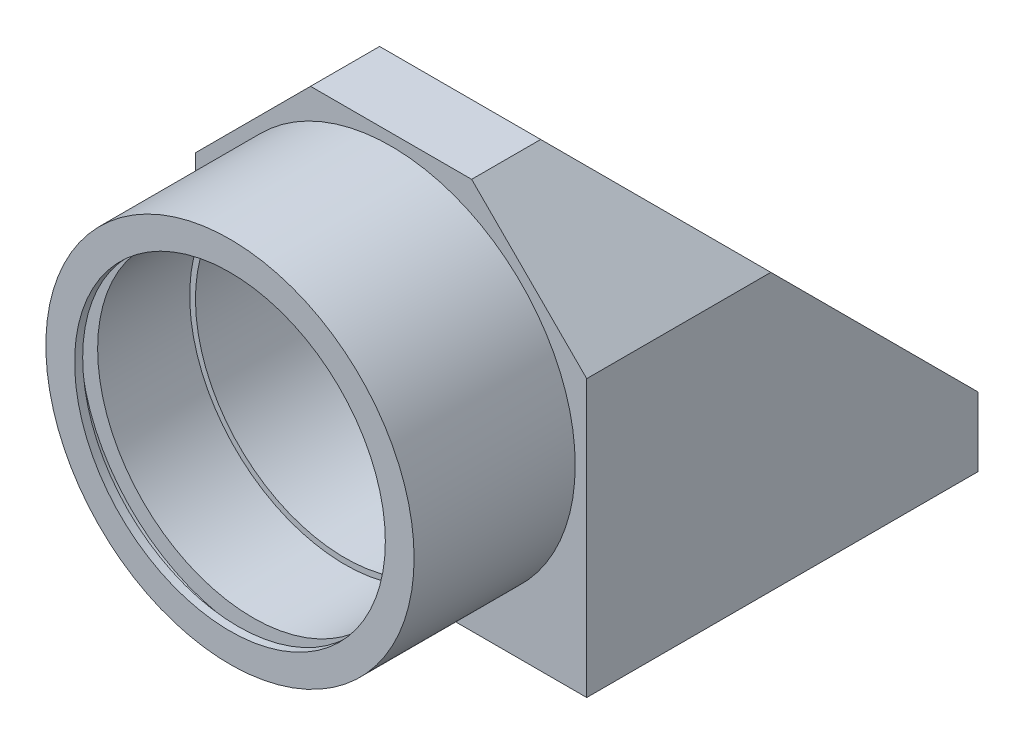
ISO-10303-21;
HEADER;
FILE_DESCRIPTION(('STEP AP214'),'2;1');
FILE_NAME('part.step','',(''),(''),'','','');
FILE_SCHEMA(('AUTOMOTIVE_DESIGN { 1 0 10303 214 1 1 1 1 }'));
ENDSEC;
DATA;
#1=APPLICATION_CONTEXT('core data for automotive mechanical design processes');
#2=APPLICATION_PROTOCOL_DEFINITION('international standard','automotive_design',2000,#1);
#3=PRODUCT_CONTEXT('',#1,'mechanical');
#4=PRODUCT('Part','Part','',(#3));
#5=PRODUCT_RELATED_PRODUCT_CATEGORY('part','',(#4));
#6=PRODUCT_DEFINITION_FORMATION('','',#4);
#7=PRODUCT_DEFINITION_CONTEXT('part definition',#1,'design');
#8=PRODUCT_DEFINITION('design','',#6,#7);
#9=PRODUCT_DEFINITION_SHAPE('','',#8);
#10=(LENGTH_UNIT() NAMED_UNIT(*) SI_UNIT(.MILLI.,.METRE.));
#11=(NAMED_UNIT(*) PLANE_ANGLE_UNIT() SI_UNIT($,.RADIAN.));
#12=(NAMED_UNIT(*) SI_UNIT($,.STERADIAN.) SOLID_ANGLE_UNIT());
#13=UNCERTAINTY_MEASURE_WITH_UNIT(LENGTH_MEASURE(1.E-05),#10,'distance_accuracy_value','');
#14=(GEOMETRIC_REPRESENTATION_CONTEXT(3) GLOBAL_UNCERTAINTY_ASSIGNED_CONTEXT((#13)) GLOBAL_UNIT_ASSIGNED_CONTEXT((#10,
#11,#12)) REPRESENTATION_CONTEXT('',''));
#15=CARTESIAN_POINT('',(0.,0.,0.));
#16=DIRECTION('',(0.,0.,1.));
#17=DIRECTION('',(1.,0.,0.));
#18=AXIS2_PLACEMENT_3D('',#15,#16,#17);
#19=CARTESIAN_POINT('',(0.,0.,38.));
#20=DIRECTION('',(0.,0.,1.));
#21=DIRECTION('',(1.,0.,0.));
#22=AXIS2_PLACEMENT_3D('',#19,#20,#21);
#23=CYLINDRICAL_SURFACE('',#22,13.5);
#24=CARTESIAN_POINT('',(0.,0.,46.));
#25=DIRECTION('',(0.,0.,-1.));
#26=DIRECTION('',(-1.,0.,0.));
#27=AXIS2_PLACEMENT_3D('',#24,#25,#26);
#28=CIRCLE('',#27,13.5);
#29=CARTESIAN_POINT('',(-13.5,0.,46.));
#30=VERTEX_POINT('',#29);
#31=EDGE_CURVE('E599',#30,#30,#28,.T.);
#32=ORIENTED_EDGE('',*,*,#31,.F.);
#33=EDGE_LOOP('',(#32));
#34=FACE_BOUND('',#33,.T.);
#35=CARTESIAN_POINT('',(0.,0.,38.));
#36=DIRECTION('',(0.,0.,1.));
#37=DIRECTION('',(1.,0.,0.));
#38=AXIS2_PLACEMENT_3D('',#35,#36,#37);
#39=CIRCLE('',#38,13.5);
#40=CARTESIAN_POINT('',(13.5,0.,38.));
#41=VERTEX_POINT('',#40);
#42=EDGE_CURVE('E201',#41,#41,#39,.T.);
#43=ORIENTED_EDGE('',*,*,#42,.F.);
#44=EDGE_LOOP('',(#43));
#45=FACE_BOUND('',#44,.T.);
#46=ADVANCED_FACE('F37',(#34,#45),#23,.F.);
#47=CARTESIAN_POINT('',(17.,17.,48.));
#48=DIRECTION('',(0.,0.,-1.));
#49=DIRECTION('',(-1.,0.,0.));
#50=AXIS2_PLACEMENT_3D('',#47,#48,#49);
#51=PLANE('',#50);
#52=CARTESIAN_POINT('',(0.,0.,48.));
#53=DIRECTION('',(0.,0.,1.));
#54=DIRECTION('',(1.,0.,0.));
#55=AXIS2_PLACEMENT_3D('',#52,#53,#54);
#56=CIRCLE('',#55,13.5);
#57=CARTESIAN_POINT('',(13.5,0.,48.));
#58=VERTEX_POINT('',#57);
#59=EDGE_CURVE('E200',#58,#58,#56,.T.);
#60=ORIENTED_EDGE('',*,*,#59,.F.);
#61=EDGE_LOOP('',(#60));
#62=FACE_BOUND('',#61,.T.);
#63=CARTESIAN_POINT('',(0.,0.,48.));
#64=DIRECTION('',(0.,0.,1.));
#65=DIRECTION('',(1.,0.,0.));
#66=AXIS2_PLACEMENT_3D('',#63,#64,#65);
#67=CIRCLE('',#66,16.);
#68=CARTESIAN_POINT('',(16.,0.,48.));
#69=VERTEX_POINT('',#68);
#70=EDGE_CURVE('E168',#69,#69,#67,.T.);
#71=ORIENTED_EDGE('',*,*,#70,.T.);
#72=EDGE_LOOP('',(#71));
#73=FACE_BOUND('',#72,.T.);
#74=ADVANCED_FACE('F298',(#62,#73),#51,.F.);
#75=CARTESIAN_POINT('',(17.,-17.,48.));
#76=DIRECTION('',(-1.,0.,0.));
#77=DIRECTION('',(0.,0.,1.));
#78=AXIS2_PLACEMENT_3D('',#75,#76,#77);
#79=PLANE('',#78);
#80=DIRECTION('',(0.,1.,0.));
#81=VECTOR('',#80,1.);
#82=CARTESIAN_POINT('',(17.,-17.,34.));
#83=LINE('',#82,#81);
#84=CARTESIAN_POINT('',(17.,-17.,34.));
#85=VERTEX_POINT('',#84);
#86=CARTESIAN_POINT('',(17.,6.99999999999996,34.));
#87=VERTEX_POINT('',#86);
#88=EDGE_CURVE('E184',#85,#87,#83,.T.);
#89=ORIENTED_EDGE('',*,*,#88,.F.);
#90=DIRECTION('',(0.,0.,-1.));
#91=VECTOR('',#90,1.);
#92=CARTESIAN_POINT('',(17.,-17.,48.));
#93=LINE('',#92,#91);
#94=CARTESIAN_POINT('',(17.,-17.,0.));
#95=VERTEX_POINT('',#94);
#96=EDGE_CURVE('E219',#85,#95,#93,.T.);
#97=ORIENTED_EDGE('',*,*,#96,.T.);
#98=DIRECTION('',(0.,1.,0.));
#99=VECTOR('',#98,1.);
#100=CARTESIAN_POINT('',(17.,-17.,0.));
#101=LINE('',#100,#99);
#102=CARTESIAN_POINT('',(17.,-11.0000000000002,0.));
#103=VERTEX_POINT('',#102);
#104=EDGE_CURVE('E211',#95,#103,#101,.T.);
#105=ORIENTED_EDGE('',*,*,#104,.T.);
#106=DIRECTION('',(0.,0.707106781186544,0.707106781186551));
#107=VECTOR('',#106,1.);
#108=CARTESIAN_POINT('',(17.,17.,28.0000000000005));
#109=LINE('',#108,#107);
#110=CARTESIAN_POINT('',(17.,6.99999999999994,18.0000000000003));
#111=VERTEX_POINT('',#110);
#112=EDGE_CURVE('E45',#103,#111,#109,.T.);
#113=ORIENTED_EDGE('',*,*,#112,.T.);
#114=DIRECTION('',(0.,0.,1.));
#115=VECTOR('',#114,1.);
#116=CARTESIAN_POINT('',(17.,6.99999999999994,48.));
#117=LINE('',#116,#115);
#118=EDGE_CURVE('E238',#111,#87,#117,.T.);
#119=ORIENTED_EDGE('',*,*,#118,.T.);
#120=EDGE_LOOP('',(#89,#97,#105,#113,#119));
#121=FACE_BOUND('',#120,.T.);
#122=ADVANCED_FACE('F274',(#121),#79,.F.);
#123=CARTESIAN_POINT('',(-17.,17.,48.));
#124=DIRECTION('',(0.,-1.,0.));
#125=DIRECTION('',(0.,0.,-1.));
#126=AXIS2_PLACEMENT_3D('',#123,#124,#125);
#127=PLANE('',#126);
#128=DIRECTION('',(-1.,0.,0.));
#129=VECTOR('',#128,1.);
#130=CARTESIAN_POINT('',(7.,17.,34.));
#131=LINE('',#130,#129);
#132=CARTESIAN_POINT('',(7.,17.,34.));
#133=VERTEX_POINT('',#132);
#134=CARTESIAN_POINT('',(-6.99999999999998,17.,34.));
#135=VERTEX_POINT('',#134);
#136=EDGE_CURVE('E52',#133,#135,#131,.T.);
#137=ORIENTED_EDGE('',*,*,#136,.F.);
#138=DIRECTION('',(0.,0.,-1.));
#139=VECTOR('',#138,1.);
#140=CARTESIAN_POINT('',(6.99999999999998,17.,48.));
#141=LINE('',#140,#139);
#142=CARTESIAN_POINT('',(6.99999999999998,17.,28.0000000000005));
#143=VERTEX_POINT('',#142);
#144=EDGE_CURVE('E236',#133,#143,#141,.T.);
#145=ORIENTED_EDGE('',*,*,#144,.T.);
#146=DIRECTION('',(-1.,0.,0.));
#147=VECTOR('',#146,1.);
#148=CARTESIAN_POINT('',(-6.99999999999998,17.,28.0000000000005));
#149=LINE('',#148,#147);
#150=CARTESIAN_POINT('',(-6.99999999999998,17.,28.0000000000005));
#151=VERTEX_POINT('',#150);
#152=EDGE_CURVE('E242',#143,#151,#149,.T.);
#153=ORIENTED_EDGE('',*,*,#152,.T.);
#154=DIRECTION('',(0.,0.,1.));
#155=VECTOR('',#154,1.);
#156=CARTESIAN_POINT('',(-6.99999999999998,17.,48.));
#157=LINE('',#156,#155);
#158=EDGE_CURVE('E233',#151,#135,#157,.T.);
#159=ORIENTED_EDGE('',*,*,#158,.T.);
#160=EDGE_LOOP('',(#137,#145,#153,#159));
#161=FACE_BOUND('',#160,.T.);
#162=ADVANCED_FACE('F290',(#161),#127,.F.);
#163=CARTESIAN_POINT('',(-17.,-17.,48.));
#164=DIRECTION('',(1.,0.,0.));
#165=DIRECTION('',(0.,0.,-1.));
#166=AXIS2_PLACEMENT_3D('',#163,#164,#165);
#167=PLANE('',#166);
#168=DIRECTION('',(0.,-1.,0.));
#169=VECTOR('',#168,1.);
#170=CARTESIAN_POINT('',(-17.,7.,34.));
#171=LINE('',#170,#169);
#172=CARTESIAN_POINT('',(-17.,7.,34.));
#173=VERTEX_POINT('',#172);
#174=CARTESIAN_POINT('',(-17.,-17.,34.));
#175=VERTEX_POINT('',#174);
#176=EDGE_CURVE('E179',#173,#175,#171,.T.);
#177=ORIENTED_EDGE('',*,*,#176,.F.);
#178=DIRECTION('',(0.,0.,-1.));
#179=VECTOR('',#178,1.);
#180=CARTESIAN_POINT('',(-17.,7.,48.));
#181=LINE('',#180,#179);
#182=CARTESIAN_POINT('',(-17.,7.,18.0000000000004));
#183=VERTEX_POINT('',#182);
#184=EDGE_CURVE('E240',#173,#183,#181,.T.);
#185=ORIENTED_EDGE('',*,*,#184,.T.);
#186=DIRECTION('',(0.,-0.707106781186544,-0.707106781186551));
#187=VECTOR('',#186,1.);
#188=CARTESIAN_POINT('',(-17.,17.,28.0000000000005));
#189=LINE('',#188,#187);
#190=CARTESIAN_POINT('',(-17.,-11.0000000000002,0.));
#191=VERTEX_POINT('',#190);
#192=EDGE_CURVE('E248',#183,#191,#189,.T.);
#193=ORIENTED_EDGE('',*,*,#192,.T.);
#194=DIRECTION('',(0.,-1.,0.));
#195=VECTOR('',#194,1.);
#196=CARTESIAN_POINT('',(-17.,-17.,0.));
#197=LINE('',#196,#195);
#198=CARTESIAN_POINT('',(-17.,-17.,0.));
#199=VERTEX_POINT('',#198);
#200=EDGE_CURVE('E213',#191,#199,#197,.T.);
#201=ORIENTED_EDGE('',*,*,#200,.T.);
#202=DIRECTION('',(0.,0.,-1.));
#203=VECTOR('',#202,1.);
#204=CARTESIAN_POINT('',(-17.,-17.,48.));
#205=LINE('',#204,#203);
#206=EDGE_CURVE('E222',#175,#199,#205,.T.);
#207=ORIENTED_EDGE('',*,*,#206,.F.);
#208=EDGE_LOOP('',(#177,#185,#193,#201,#207));
#209=FACE_BOUND('',#208,.T.);
#210=ADVANCED_FACE('F284',(#209),#167,.F.);
#211=CARTESIAN_POINT('',(-17.,-17.,48.));
#212=DIRECTION('',(0.,1.,0.));
#213=DIRECTION('',(0.,0.,1.));
#214=AXIS2_PLACEMENT_3D('',#211,#212,#213);
#215=PLANE('',#214);
#216=CARTESIAN_POINT('',(13.,-17.,30.));
#217=DIRECTION('',(0.,-1.,0.));
#218=DIRECTION('',(0.,0.,-1.));
#219=AXIS2_PLACEMENT_3D('',#216,#217,#218);
#220=CIRCLE('',#219,1.64999999999999);
#221=CARTESIAN_POINT('',(13.,-17.,28.3500000000001));
#222=VERTEX_POINT('',#221);
#223=EDGE_CURVE('E140',#222,#222,#220,.T.);
#224=ORIENTED_EDGE('',*,*,#223,.F.);
#225=EDGE_LOOP('',(#224));
#226=FACE_BOUND('',#225,.T.);
#227=CARTESIAN_POINT('',(13.,-17.,4.));
#228=DIRECTION('',(0.,-1.,0.));
#229=DIRECTION('',(0.,0.,-1.));
#230=AXIS2_PLACEMENT_3D('',#227,#228,#229);
#231=CIRCLE('',#230,1.64999999999999);
#232=CARTESIAN_POINT('',(13.,-17.,2.35000000000001));
#233=VERTEX_POINT('',#232);
#234=EDGE_CURVE('E139',#233,#233,#231,.T.);
#235=ORIENTED_EDGE('',*,*,#234,.F.);
#236=EDGE_LOOP('',(#235));
#237=FACE_BOUND('',#236,.T.);
#238=CARTESIAN_POINT('',(-13.,-17.,3.99999999999995));
#239=DIRECTION('',(0.,-1.,0.));
#240=DIRECTION('',(0.,0.,-1.));
#241=AXIS2_PLACEMENT_3D('',#238,#239,#240);
#242=CIRCLE('',#241,1.64999999999999);
#243=CARTESIAN_POINT('',(-13.,-17.,2.34999999999996));
#244=VERTEX_POINT('',#243);
#245=EDGE_CURVE('E155',#244,#244,#242,.T.);
#246=ORIENTED_EDGE('',*,*,#245,.F.);
#247=EDGE_LOOP('',(#246));
#248=FACE_BOUND('',#247,.T.);
#249=CARTESIAN_POINT('',(-13.,-17.,30.));
#250=DIRECTION('',(0.,-1.,0.));
#251=DIRECTION('',(0.,0.,-1.));
#252=AXIS2_PLACEMENT_3D('',#249,#250,#251);
#253=CIRCLE('',#252,1.64999999999999);
#254=CARTESIAN_POINT('',(-13.,-17.,28.35));
#255=VERTEX_POINT('',#254);
#256=EDGE_CURVE('E161',#255,#255,#253,.T.);
#257=ORIENTED_EDGE('',*,*,#256,.F.);
#258=EDGE_LOOP('',(#257));
#259=FACE_BOUND('',#258,.T.);
#260=CARTESIAN_POINT('',(0.,-17.,17.));
#261=DIRECTION('',(0.,-1.,0.));
#262=DIRECTION('',(0.,0.,-1.));
#263=AXIS2_PLACEMENT_3D('',#260,#261,#262);
#264=CIRCLE('',#263,13.);
#265=CARTESIAN_POINT('',(0.,-17.,4.));
#266=VERTEX_POINT('',#265);
#267=EDGE_CURVE('E189',#266,#266,#264,.T.);
#268=ORIENTED_EDGE('',*,*,#267,.F.);
#269=EDGE_LOOP('',(#268));
#270=FACE_BOUND('',#269,.T.);
#271=DIRECTION('',(1.,0.,0.));
#272=VECTOR('',#271,1.);
#273=CARTESIAN_POINT('',(-17.,-17.,34.));
#274=LINE('',#273,#272);
#275=EDGE_CURVE('E181',#175,#85,#274,.T.);
#276=ORIENTED_EDGE('',*,*,#275,.F.);
#277=ORIENTED_EDGE('',*,*,#206,.T.);
#278=DIRECTION('',(1.,0.,0.));
#279=VECTOR('',#278,1.);
#280=CARTESIAN_POINT('',(-17.,-17.,0.));
#281=LINE('',#280,#279);
#282=EDGE_CURVE('E216',#199,#95,#281,.T.);
#283=ORIENTED_EDGE('',*,*,#282,.T.);
#284=ORIENTED_EDGE('',*,*,#96,.F.);
#285=EDGE_LOOP('',(#276,#277,#283,#284));
#286=FACE_BOUND('',#285,.T.);
#287=ADVANCED_FACE('F278',(#226,#237,#248,#259,#270,#286),#215,.F.);
#288=CARTESIAN_POINT('',(6.99999999999998,17.,48.));
#289=DIRECTION('',(-0.707106781186549,-0.707106781186546,0.));
#290=DIRECTION('',(0.707106781186546,-0.707106781186549,0.));
#291=AXIS2_PLACEMENT_3D('',#288,#289,#290);
#292=PLANE('',#291);
#293=ORIENTED_EDGE('',*,*,#144,.F.);
#294=DIRECTION('',(-0.707106781186546,0.707106781186549,0.));
#295=VECTOR('',#294,1.);
#296=CARTESIAN_POINT('',(17.,6.99999999999996,34.));
#297=LINE('',#296,#295);
#298=EDGE_CURVE('E187',#87,#133,#297,.T.);
#299=ORIENTED_EDGE('',*,*,#298,.F.);
#300=ORIENTED_EDGE('',*,*,#118,.F.);
#301=DIRECTION('',(0.577350269189622,-0.577350269189624,-0.577350269189631));
#302=VECTOR('',#301,1.);
#303=CARTESIAN_POINT('',(0.333333333333461,23.6666666666665,34.6666666666671));
#304=LINE('',#303,#302);
#305=EDGE_CURVE('E11',#111,#143,#304,.F.);
#306=ORIENTED_EDGE('',*,*,#305,.T.);
#307=EDGE_LOOP('',(#293,#299,#300,#306));
#308=FACE_BOUND('',#307,.T.);
#309=ADVANCED_FACE('F271',(#308),#292,.F.);
#310=CARTESIAN_POINT('',(-17.,7.,48.));
#311=DIRECTION('',(0.707106781186546,-0.707106781186549,0.));
#312=DIRECTION('',(0.707106781186549,0.707106781186546,0.));
#313=AXIS2_PLACEMENT_3D('',#310,#311,#312);
#314=PLANE('',#313);
#315=ORIENTED_EDGE('',*,*,#184,.F.);
#316=DIRECTION('',(-0.707106781186549,-0.707106781186546,0.));
#317=VECTOR('',#316,1.);
#318=CARTESIAN_POINT('',(-6.99999999999998,17.,34.));
#319=LINE('',#318,#317);
#320=EDGE_CURVE('E177',#135,#173,#319,.T.);
#321=ORIENTED_EDGE('',*,*,#320,.F.);
#322=ORIENTED_EDGE('',*,*,#158,.F.);
#323=DIRECTION('',(0.577350269189625,0.577350269189623,0.577350269189629));
#324=VECTOR('',#323,1.);
#325=CARTESIAN_POINT('',(-7.00000000000009,16.9999999999999,28.0000000000004));
#326=LINE('',#325,#324);
#327=EDGE_CURVE('E245',#151,#183,#326,.F.);
#328=ORIENTED_EDGE('',*,*,#327,.T.);
#329=EDGE_LOOP('',(#315,#321,#322,#328));
#330=FACE_BOUND('',#329,.T.);
#331=ADVANCED_FACE('F288',(#330),#314,.F.);
#332=CARTESIAN_POINT('',(0.,0.,48.));
#333=DIRECTION('',(0.,0.,-1.));
#334=DIRECTION('',(-1.,0.,0.));
#335=AXIS2_PLACEMENT_3D('',#332,#333,#334);
#336=CYLINDRICAL_SURFACE('',#335,13.);
#337=CARTESIAN_POINT('',(0.,0.,38.));
#338=DIRECTION('',(0.,0.,1.));
#339=DIRECTION('',(1.,0.,0.));
#340=AXIS2_PLACEMENT_3D('',#337,#338,#339);
#341=CIRCLE('',#340,13.);
#342=CARTESIAN_POINT('',(13.,0.,38.));
#343=VERTEX_POINT('',#342);
#344=EDGE_CURVE('E205',#343,#343,#341,.T.);
#345=ORIENTED_EDGE('',*,*,#344,.T.);
#346=EDGE_LOOP('',(#345));
#347=FACE_BOUND('',#346,.T.);
#348=CARTESIAN_POINT('',(0.,0.,0.));
#349=DIRECTION('',(0.,0.,1.));
#350=DIRECTION('',(1.,0.,0.));
#351=AXIS2_PLACEMENT_3D('',#348,#349,#350);
#352=CIRCLE('',#351,13.);
#353=CARTESIAN_POINT('',(-6.9282032302752,-11.0000000000002,0.));
#354=VERTEX_POINT('',#353);
#355=CARTESIAN_POINT('',(6.9282032302752,-11.0000000000002,0.));
#356=VERTEX_POINT('',#355);
#357=EDGE_CURVE('E208',#354,#356,#352,.T.);
#358=ORIENTED_EDGE('',*,*,#357,.F.);
#359=CARTESIAN_POINT('',(0.,0.,11.0000000000003));
#360=DIRECTION('',(0.,0.707106781186551,-0.707106781186544));
#361=DIRECTION('',(0.,-0.707106781186544,-0.707106781186551));
#362=AXIS2_PLACEMENT_3D('',#359,#360,#361);
#363=ELLIPSE('',#362,18.3847763108503,13.);
#364=EDGE_CURVE('E254',#354,#356,#363,.T.);
#365=ORIENTED_EDGE('',*,*,#364,.T.);
#366=EDGE_LOOP('',(#358,#365));
#367=FACE_BOUND('',#366,.T.);
#368=CARTESIAN_POINT('',(0.,0.,17.));
#369=DIRECTION('',(0.,-0.707106781186547,-0.707106781186547));
#370=DIRECTION('',(0.,0.707106781186547,-0.707106781186547));
#371=AXIS2_PLACEMENT_3D('',#368,#369,#370);
#372=ELLIPSE('',#371,18.3847763108502,13.);
#373=CARTESIAN_POINT('',(-10.9544511501033,-7.00000000000001,24.));
#374=VERTEX_POINT('',#373);
#375=CARTESIAN_POINT('',(10.9544511501033,-7.00000000000001,24.));
#376=VERTEX_POINT('',#375);
#377=EDGE_CURVE('E197',#374,#376,#372,.F.);
#378=ORIENTED_EDGE('',*,*,#377,.F.);
#379=DIRECTION('',(0.,0.,-1.));
#380=VECTOR('',#379,1.);
#381=CARTESIAN_POINT('',(-10.9544511501033,-7.00000000000001,48.));
#382=LINE('',#381,#380);
#383=CARTESIAN_POINT('',(-10.9544511501033,-7.00000000000001,9.99999999999999));
#384=VERTEX_POINT('',#383);
#385=EDGE_CURVE('E230',#374,#384,#382,.T.);
#386=ORIENTED_EDGE('',*,*,#385,.T.);
#387=CARTESIAN_POINT('',(0.,0.,17.));
#388=DIRECTION('',(0.,0.707106781186547,-0.707106781186547));
#389=DIRECTION('',(0.,-0.707106781186547,-0.707106781186547));
#390=AXIS2_PLACEMENT_3D('',#387,#388,#389);
#391=ELLIPSE('',#390,18.3847763108502,13.);
#392=CARTESIAN_POINT('',(10.9544511501033,-7.00000000000001,9.99999999999999));
#393=VERTEX_POINT('',#392);
#394=EDGE_CURVE('E192',#393,#384,#391,.T.);
#395=ORIENTED_EDGE('',*,*,#394,.F.);
#396=DIRECTION('',(0.,0.,-1.));
#397=VECTOR('',#396,1.);
#398=CARTESIAN_POINT('',(10.9544511501033,-7.00000000000001,48.));
#399=LINE('',#398,#397);
#400=EDGE_CURVE('E224',#393,#376,#399,.F.);
#401=ORIENTED_EDGE('',*,*,#400,.T.);
#402=EDGE_LOOP('',(#378,#386,#395,#401));
#403=FACE_BOUND('',#402,.T.);
#404=ADVANCED_FACE('F258',(#347,#367,#403),#336,.F.);
#405=CARTESIAN_POINT('',(17.,17.,0.));
#406=DIRECTION('',(0.,0.,-1.));
#407=DIRECTION('',(-1.,0.,0.));
#408=AXIS2_PLACEMENT_3D('',#405,#406,#407);
#409=PLANE('',#408);
#410=ORIENTED_EDGE('',*,*,#200,.F.);
#411=DIRECTION('',(1.,0.,0.));
#412=VECTOR('',#411,1.);
#413=CARTESIAN_POINT('',(6.99999999999998,-11.0000000000002,0.));
#414=LINE('',#413,#412);
#415=EDGE_CURVE('E252',#191,#354,#414,.T.);
#416=ORIENTED_EDGE('',*,*,#415,.T.);
#417=ORIENTED_EDGE('',*,*,#357,.T.);
#418=DIRECTION('',(1.,0.,0.));
#419=VECTOR('',#418,1.);
#420=CARTESIAN_POINT('',(6.99999999999998,-11.0000000000002,0.));
#421=LINE('',#420,#419);
#422=EDGE_CURVE('E250',#356,#103,#421,.T.);
#423=ORIENTED_EDGE('',*,*,#422,.T.);
#424=ORIENTED_EDGE('',*,*,#104,.F.);
#425=ORIENTED_EDGE('',*,*,#282,.F.);
#426=EDGE_LOOP('',(#410,#416,#417,#423,#424,#425));
#427=FACE_BOUND('',#426,.T.);
#428=ADVANCED_FACE('F265',(#427),#409,.T.);
#429=CARTESIAN_POINT('',(0.,0.,47.3));
#430=DIRECTION('',(0.,0.,-1.));
#431=DIRECTION('',(-1.,0.,0.));
#432=AXIS2_PLACEMENT_3D('',#429,#430,#431);
#433=CIRCLE('',#432,13.5);
#434=CARTESIAN_POINT('',(-13.5,0.,47.3));
#435=VERTEX_POINT('',#434);
#436=EDGE_CURVE('E326',#435,#435,#433,.T.);
#437=ORIENTED_EDGE('',*,*,#436,.T.);
#438=EDGE_LOOP('',(#437));
#439=FACE_BOUND('',#438,.T.);
#440=ORIENTED_EDGE('',*,*,#59,.T.);
#441=EDGE_LOOP('',(#440));
#442=FACE_BOUND('',#441,.T.);
#443=ADVANCED_FACE('F303',(#439,#442),#23,.F.);
#444=CARTESIAN_POINT('',(0.,0.,38.));
#445=DIRECTION('',(0.,0.,1.));
#446=DIRECTION('',(1.,0.,0.));
#447=AXIS2_PLACEMENT_3D('',#444,#445,#446);
#448=PLANE('',#447);
#449=ORIENTED_EDGE('',*,*,#344,.F.);
#450=EDGE_LOOP('',(#449));
#451=FACE_BOUND('',#450,.T.);
#452=ORIENTED_EDGE('',*,*,#42,.T.);
#453=EDGE_LOOP('',(#452));
#454=FACE_BOUND('',#453,.T.);
#455=ADVANCED_FACE('F314',(#451,#454),#448,.T.);
#456=CARTESIAN_POINT('',(0.,-7.00000000000001,17.));
#457=DIRECTION('',(0.,-1.,0.));
#458=DIRECTION('',(0.,0.,-1.));
#459=AXIS2_PLACEMENT_3D('',#456,#457,#458);
#460=PLANE('',#459);
#461=CARTESIAN_POINT('',(0.,-7.00000000000001,17.));
#462=DIRECTION('',(0.,-1.,0.));
#463=DIRECTION('',(0.,0.,-1.));
#464=AXIS2_PLACEMENT_3D('',#461,#462,#463);
#465=CIRCLE('',#464,13.);
#466=EDGE_CURVE('E193',#374,#384,#465,.T.);
#467=ORIENTED_EDGE('',*,*,#466,.T.);
#468=ORIENTED_EDGE('',*,*,#385,.F.);
#469=EDGE_LOOP('',(#467,#468));
#470=FACE_BOUND('',#469,.T.);
#471=ADVANCED_FACE('F320',(#470),#460,.T.);
#472=CARTESIAN_POINT('',(0.,-7.00000000000001,17.));
#473=DIRECTION('',(0.,-1.,0.));
#474=DIRECTION('',(0.,0.,-1.));
#475=AXIS2_PLACEMENT_3D('',#472,#473,#474);
#476=CYLINDRICAL_SURFACE('',#475,13.);
#477=ORIENTED_EDGE('',*,*,#377,.T.);
#478=EDGE_CURVE('E190',#393,#376,#465,.T.);
#479=ORIENTED_EDGE('',*,*,#478,.F.);
#480=ORIENTED_EDGE('',*,*,#394,.T.);
#481=ORIENTED_EDGE('',*,*,#466,.F.);
#482=EDGE_LOOP('',(#477,#479,#480,#481));
#483=FACE_BOUND('',#482,.T.);
#484=ORIENTED_EDGE('',*,*,#267,.T.);
#485=EDGE_LOOP('',(#484));
#486=FACE_BOUND('',#485,.T.);
#487=ADVANCED_FACE('F351',(#483,#486),#476,.F.);
#488=ORIENTED_EDGE('',*,*,#478,.T.);
#489=ORIENTED_EDGE('',*,*,#400,.F.);
#490=EDGE_LOOP('',(#488,#489));
#491=FACE_BOUND('',#490,.T.);
#492=ADVANCED_FACE('F348',(#491),#460,.T.);
#493=CARTESIAN_POINT('',(-17.,17.,28.0000000000005));
#494=DIRECTION('',(0.,0.707106781186551,-0.707106781186544));
#495=DIRECTION('',(0.,0.707106781186544,0.707106781186551));
#496=AXIS2_PLACEMENT_3D('',#493,#494,#495);
#497=PLANE('',#496);
#498=ORIENTED_EDGE('',*,*,#364,.F.);
#499=ORIENTED_EDGE('',*,*,#415,.F.);
#500=ORIENTED_EDGE('',*,*,#192,.F.);
#501=ORIENTED_EDGE('',*,*,#327,.F.);
#502=ORIENTED_EDGE('',*,*,#152,.F.);
#503=ORIENTED_EDGE('',*,*,#305,.F.);
#504=ORIENTED_EDGE('',*,*,#112,.F.);
#505=ORIENTED_EDGE('',*,*,#422,.F.);
#506=EDGE_LOOP('',(#498,#499,#500,#501,#502,#503,#504,#505));
#507=FACE_BOUND('',#506,.T.);
#508=ADVANCED_FACE('F39',(#507),#497,.T.);
#509=CARTESIAN_POINT('',(-17.,17.,34.));
#510=DIRECTION('',(0.,0.,1.));
#511=DIRECTION('',(1.,0.,0.));
#512=AXIS2_PLACEMENT_3D('',#509,#510,#511);
#513=PLANE('',#512);
#514=CARTESIAN_POINT('',(0.,0.,34.));
#515=DIRECTION('',(0.,0.,1.));
#516=DIRECTION('',(1.,0.,0.));
#517=AXIS2_PLACEMENT_3D('',#514,#515,#516);
#518=CIRCLE('',#517,16.);
#519=CARTESIAN_POINT('',(16.,0.,34.));
#520=VERTEX_POINT('',#519);
#521=EDGE_CURVE('E169',#520,#520,#518,.T.);
#522=ORIENTED_EDGE('',*,*,#521,.F.);
#523=EDGE_LOOP('',(#522));
#524=FACE_BOUND('',#523,.T.);
#525=ORIENTED_EDGE('',*,*,#136,.T.);
#526=ORIENTED_EDGE('',*,*,#320,.T.);
#527=ORIENTED_EDGE('',*,*,#176,.T.);
#528=ORIENTED_EDGE('',*,*,#275,.T.);
#529=ORIENTED_EDGE('',*,*,#88,.T.);
#530=ORIENTED_EDGE('',*,*,#298,.T.);
#531=EDGE_LOOP('',(#525,#526,#527,#528,#529,#530));
#532=FACE_BOUND('',#531,.T.);
#533=ADVANCED_FACE('F334',(#524,#532),#513,.T.);
#534=CARTESIAN_POINT('',(0.,0.,34.));
#535=DIRECTION('',(0.,0.,1.));
#536=DIRECTION('',(1.,0.,0.));
#537=AXIS2_PLACEMENT_3D('',#534,#535,#536);
#538=CYLINDRICAL_SURFACE('',#537,16.);
#539=ORIENTED_EDGE('',*,*,#521,.T.);
#540=EDGE_LOOP('',(#539));
#541=FACE_BOUND('',#540,.T.);
#542=ORIENTED_EDGE('',*,*,#70,.F.);
#543=EDGE_LOOP('',(#542));
#544=FACE_BOUND('',#543,.T.);
#545=ADVANCED_FACE('F331',(#541,#544),#538,.T.);
#546=CARTESIAN_POINT('',(-13.,-9.00000000000001,30.));
#547=DIRECTION('',(0.,-1.,0.));
#548=DIRECTION('',(0.,0.,-1.));
#549=AXIS2_PLACEMENT_3D('',#546,#547,#548);
#550=CONICAL_SURFACE('',#549,1.65,1.02974425867665);
#551=CARTESIAN_POINT('',(-13.0000000000001,-8.00857997860453,30.));
#552=VERTEX_POINT('',#551);
#553=VERTEX_LOOP('',#552);
#554=FACE_BOUND('',#553,.T.);
#555=CARTESIAN_POINT('',(-13.,-9.00000000000001,30.));
#556=DIRECTION('',(0.,-1.,0.));
#557=DIRECTION('',(0.,0.,-1.));
#558=AXIS2_PLACEMENT_3D('',#555,#556,#557);
#559=CIRCLE('',#558,1.65);
#560=CARTESIAN_POINT('',(-13.,-9.00000000000001,28.35));
#561=VERTEX_POINT('',#560);
#562=EDGE_CURVE('E164',#561,#561,#559,.T.);
#563=ORIENTED_EDGE('',*,*,#562,.T.);
#564=EDGE_LOOP('',(#563));
#565=FACE_BOUND('',#564,.T.);
#566=ADVANCED_FACE('F333',(#554,#565),#550,.F.);
#567=CARTESIAN_POINT('',(-13.,-17.,30.));
#568=DIRECTION('',(0.,-1.,0.));
#569=DIRECTION('',(0.,0.,-1.));
#570=AXIS2_PLACEMENT_3D('',#567,#568,#569);
#571=CYLINDRICAL_SURFACE('',#570,1.64999999999999);
#572=ORIENTED_EDGE('',*,*,#562,.F.);
#573=EDGE_LOOP('',(#572));
#574=FACE_BOUND('',#573,.T.);
#575=ORIENTED_EDGE('',*,*,#256,.T.);
#576=EDGE_LOOP('',(#575));
#577=FACE_BOUND('',#576,.T.);
#578=ADVANCED_FACE('F341',(#574,#577),#571,.F.);
#579=CARTESIAN_POINT('',(-13.,-9.00000000000001,3.99999999999995));
#580=DIRECTION('',(0.,-1.,0.));
#581=DIRECTION('',(0.,0.,-1.));
#582=AXIS2_PLACEMENT_3D('',#579,#580,#581);
#583=CONICAL_SURFACE('',#582,1.65,1.02974425867665);
#584=CARTESIAN_POINT('',(-13.,-8.00857997860453,3.99999999999995));
#585=VERTEX_POINT('',#584);
#586=VERTEX_LOOP('',#585);
#587=FACE_BOUND('',#586,.T.);
#588=CARTESIAN_POINT('',(-13.,-9.00000000000001,3.99999999999995));
#589=DIRECTION('',(0.,-1.,0.));
#590=DIRECTION('',(0.,0.,-1.));
#591=AXIS2_PLACEMENT_3D('',#588,#589,#590);
#592=CIRCLE('',#591,1.65);
#593=CARTESIAN_POINT('',(-13.,-9.00000000000001,2.34999999999995));
#594=VERTEX_POINT('',#593);
#595=EDGE_CURVE('E158',#594,#594,#592,.T.);
#596=ORIENTED_EDGE('',*,*,#595,.T.);
#597=EDGE_LOOP('',(#596));
#598=FACE_BOUND('',#597,.T.);
#599=ADVANCED_FACE('F534',(#587,#598),#583,.F.);
#600=CARTESIAN_POINT('',(-13.,-17.,3.99999999999995));
#601=DIRECTION('',(0.,-1.,0.));
#602=DIRECTION('',(0.,0.,-1.));
#603=AXIS2_PLACEMENT_3D('',#600,#601,#602);
#604=CYLINDRICAL_SURFACE('',#603,1.64999999999999);
#605=ORIENTED_EDGE('',*,*,#595,.F.);
#606=EDGE_LOOP('',(#605));
#607=FACE_BOUND('',#606,.T.);
#608=ORIENTED_EDGE('',*,*,#245,.T.);
#609=EDGE_LOOP('',(#608));
#610=FACE_BOUND('',#609,.T.);
#611=ADVANCED_FACE('F525',(#607,#610),#604,.F.);
#612=CARTESIAN_POINT('',(13.,-9.00000000000001,4.));
#613=DIRECTION('',(0.,-1.,0.));
#614=DIRECTION('',(0.,0.,-1.));
#615=AXIS2_PLACEMENT_3D('',#612,#613,#614);
#616=CONICAL_SURFACE('',#615,1.65,1.02974425867665);
#617=CARTESIAN_POINT('',(13.,-8.00857997860453,4.));
#618=VERTEX_POINT('',#617);
#619=VERTEX_LOOP('',#618);
#620=FACE_BOUND('',#619,.T.);
#621=CARTESIAN_POINT('',(13.,-9.00000000000001,4.));
#622=DIRECTION('',(0.,-1.,0.));
#623=DIRECTION('',(0.,0.,-1.));
#624=AXIS2_PLACEMENT_3D('',#621,#622,#623);
#625=CIRCLE('',#624,1.65);
#626=CARTESIAN_POINT('',(13.,-9.00000000000001,2.35));
#627=VERTEX_POINT('',#626);
#628=EDGE_CURVE('E145',#627,#627,#625,.T.);
#629=ORIENTED_EDGE('',*,*,#628,.T.);
#630=EDGE_LOOP('',(#629));
#631=FACE_BOUND('',#630,.T.);
#632=ADVANCED_FACE('F516',(#620,#631),#616,.F.);
#633=CARTESIAN_POINT('',(13.,-17.,4.));
#634=DIRECTION('',(0.,-1.,0.));
#635=DIRECTION('',(0.,0.,-1.));
#636=AXIS2_PLACEMENT_3D('',#633,#634,#635);
#637=CYLINDRICAL_SURFACE('',#636,1.64999999999999);
#638=ORIENTED_EDGE('',*,*,#628,.F.);
#639=EDGE_LOOP('',(#638));
#640=FACE_BOUND('',#639,.T.);
#641=ORIENTED_EDGE('',*,*,#234,.T.);
#642=EDGE_LOOP('',(#641));
#643=FACE_BOUND('',#642,.T.);
#644=ADVANCED_FACE('F132',(#640,#643),#637,.F.);
#645=CARTESIAN_POINT('',(13.,-9.00000000000001,30.));
#646=DIRECTION('',(0.,-1.,0.));
#647=DIRECTION('',(0.,0.,-1.));
#648=AXIS2_PLACEMENT_3D('',#645,#646,#647);
#649=CONICAL_SURFACE('',#648,1.65,1.02974425867665);
#650=CARTESIAN_POINT('',(13.,-8.00857997860453,30.));
#651=VERTEX_POINT('',#650);
#652=VERTEX_LOOP('',#651);
#653=FACE_BOUND('',#652,.T.);
#654=CARTESIAN_POINT('',(13.,-9.00000000000001,30.));
#655=DIRECTION('',(0.,-1.,0.));
#656=DIRECTION('',(0.,0.,-1.));
#657=AXIS2_PLACEMENT_3D('',#654,#655,#656);
#658=CIRCLE('',#657,1.65);
#659=CARTESIAN_POINT('',(13.,-9.00000000000001,28.35));
#660=VERTEX_POINT('',#659);
#661=EDGE_CURVE('E136',#660,#660,#658,.T.);
#662=ORIENTED_EDGE('',*,*,#661,.T.);
#663=EDGE_LOOP('',(#662));
#664=FACE_BOUND('',#663,.T.);
#665=ADVANCED_FACE('F128',(#653,#664),#649,.F.);
#666=CARTESIAN_POINT('',(13.,-17.,30.));
#667=DIRECTION('',(0.,-1.,0.));
#668=DIRECTION('',(0.,0.,-1.));
#669=AXIS2_PLACEMENT_3D('',#666,#667,#668);
#670=CYLINDRICAL_SURFACE('',#669,1.64999999999999);
#671=ORIENTED_EDGE('',*,*,#661,.F.);
#672=EDGE_LOOP('',(#671));
#673=FACE_BOUND('',#672,.T.);
#674=ORIENTED_EDGE('',*,*,#223,.T.);
#675=EDGE_LOOP('',(#674));
#676=FACE_BOUND('',#675,.T.);
#677=ADVANCED_FACE('F131',(#673,#676),#670,.F.);
#678=CARTESIAN_POINT('',(0.,13.5,46.));
#679=DIRECTION('',(0.,0.,-1.));
#680=DIRECTION('',(-1.,0.,0.));
#681=AXIS2_PLACEMENT_3D('',#678,#679,#680);
#682=PLANE('',#681);
#683=CARTESIAN_POINT('',(0.,0.,46.));
#684=DIRECTION('',(0.,0.,-1.));
#685=DIRECTION('',(-1.,0.,0.));
#686=AXIS2_PLACEMENT_3D('',#683,#684,#685);
#687=CIRCLE('',#686,15.);
#688=CARTESIAN_POINT('',(-15.,0.,46.));
#689=VERTEX_POINT('',#688);
#690=EDGE_CURVE('E149',#689,#689,#687,.T.);
#691=ORIENTED_EDGE('',*,*,#690,.F.);
#692=EDGE_LOOP('',(#691));
#693=FACE_BOUND('',#692,.T.);
#694=ORIENTED_EDGE('',*,*,#31,.T.);
#695=EDGE_LOOP('',(#694));
#696=FACE_BOUND('',#695,.T.);
#697=ADVANCED_FACE('F463',(#693,#696),#682,.F.);
#698=CARTESIAN_POINT('',(0.,0.,0.));
#699=DIRECTION('',(0.,0.,-1.));
#700=DIRECTION('',(-1.,0.,0.));
#701=AXIS2_PLACEMENT_3D('',#698,#699,#700);
#702=CYLINDRICAL_SURFACE('',#701,15.);
#703=CARTESIAN_POINT('',(0.,0.,47.3));
#704=DIRECTION('',(0.,0.,-1.));
#705=DIRECTION('',(-1.,0.,0.));
#706=AXIS2_PLACEMENT_3D('',#703,#704,#705);
#707=CIRCLE('',#706,15.);
#708=CARTESIAN_POINT('',(-15.,0.,47.3));
#709=VERTEX_POINT('',#708);
#710=EDGE_CURVE('E594',#709,#709,#707,.T.);
#711=ORIENTED_EDGE('',*,*,#710,.F.);
#712=EDGE_LOOP('',(#711));
#713=FACE_BOUND('',#712,.T.);
#714=ORIENTED_EDGE('',*,*,#690,.T.);
#715=EDGE_LOOP('',(#714));
#716=FACE_BOUND('',#715,.T.);
#717=ADVANCED_FACE('F476',(#713,#716),#702,.F.);
#718=CARTESIAN_POINT('',(0.,13.5,47.3));
#719=DIRECTION('',(0.,0.,1.));
#720=DIRECTION('',(1.,0.,0.));
#721=AXIS2_PLACEMENT_3D('',#718,#719,#720);
#722=PLANE('',#721);
#723=ORIENTED_EDGE('',*,*,#436,.F.);
#724=EDGE_LOOP('',(#723));
#725=FACE_BOUND('',#724,.T.);
#726=ORIENTED_EDGE('',*,*,#710,.T.);
#727=EDGE_LOOP('',(#726));
#728=FACE_BOUND('',#727,.T.);
#729=ADVANCED_FACE('F484',(#725,#728),#722,.F.);
#730=CLOSED_SHELL('',(#46,#74,#122,#162,#210,#287,#309,#331,#404,#428,#443,#455,#471,#487,#492,
#508,#533,#545,#566,#578,#599,#611,#632,#644,#665,#677,#697,#717,#729));
#731=MANIFOLD_SOLID_BREP('B2',#730);
#732=ADVANCED_BREP_SHAPE_REPRESENTATION('',(#18,#731),#14);
#733=SHAPE_DEFINITION_REPRESENTATION(#9,#732);
ENDSEC;
END-ISO-10303-21;
